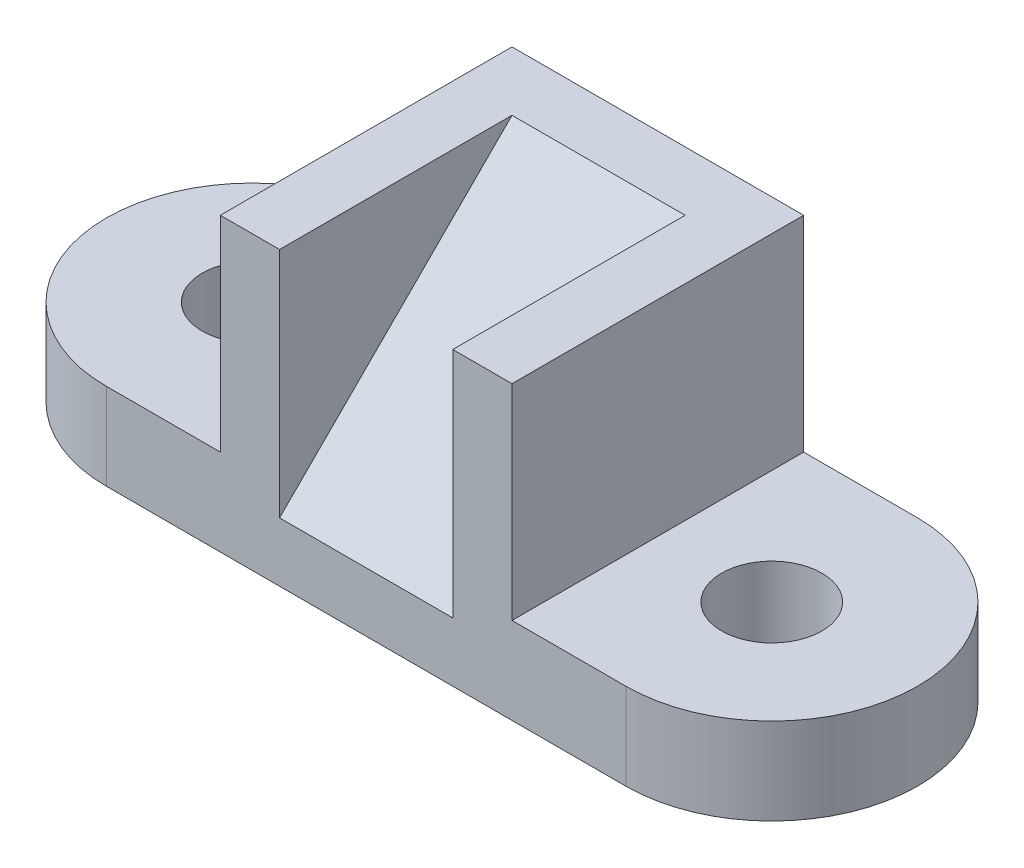
ISO-10303-21;
HEADER;
FILE_DESCRIPTION(('STEP AP214'),'2;1');
FILE_NAME('part.step','',(''),(''),'','','');
FILE_SCHEMA(('AUTOMOTIVE_DESIGN { 1 0 10303 214 1 1 1 1 }'));
ENDSEC;
DATA;
#1=APPLICATION_CONTEXT('core data for automotive mechanical design processes');
#2=APPLICATION_PROTOCOL_DEFINITION('international standard','automotive_design',2000,#1);
#3=PRODUCT_CONTEXT('',#1,'mechanical');
#4=PRODUCT('Part','Part','',(#3));
#5=PRODUCT_RELATED_PRODUCT_CATEGORY('part','',(#4));
#6=PRODUCT_DEFINITION_FORMATION('','',#4);
#7=PRODUCT_DEFINITION_CONTEXT('part definition',#1,'design');
#8=PRODUCT_DEFINITION('design','',#6,#7);
#9=PRODUCT_DEFINITION_SHAPE('','',#8);
#10=(LENGTH_UNIT() NAMED_UNIT(*) SI_UNIT(.MILLI.,.METRE.));
#11=(NAMED_UNIT(*) PLANE_ANGLE_UNIT() SI_UNIT($,.RADIAN.));
#12=(NAMED_UNIT(*) SI_UNIT($,.STERADIAN.) SOLID_ANGLE_UNIT());
#13=UNCERTAINTY_MEASURE_WITH_UNIT(LENGTH_MEASURE(1.E-05),#10,'distance_accuracy_value','');
#14=(GEOMETRIC_REPRESENTATION_CONTEXT(3) GLOBAL_UNCERTAINTY_ASSIGNED_CONTEXT((#13)) GLOBAL_UNIT_ASSIGNED_CONTEXT((#10,
#11,#12)) REPRESENTATION_CONTEXT('',''));
#15=CARTESIAN_POINT('',(0.,0.,0.));
#16=DIRECTION('',(0.,0.,1.));
#17=DIRECTION('',(1.,0.,0.));
#18=AXIS2_PLACEMENT_3D('',#15,#16,#17);
#19=CARTESIAN_POINT('',(57.,19.,0.));
#20=DIRECTION('',(0.,1.,0.));
#21=DIRECTION('',(0.,0.,1.));
#22=AXIS2_PLACEMENT_3D('',#19,#20,#21);
#23=PLANE('',#22);
#24=CARTESIAN_POINT('',(57.,19.,0.));
#25=DIRECTION('',(0.,1.,0.));
#26=DIRECTION('',(0.,0.,1.));
#27=AXIS2_PLACEMENT_3D('',#24,#25,#26);
#28=CIRCLE('',#27,11.);
#29=CARTESIAN_POINT('',(57.,19.,-11.));
#30=VERTEX_POINT('',#29);
#31=EDGE_CURVE('E141',#30,#30,#28,.T.);
#32=ORIENTED_EDGE('',*,*,#31,.F.);
#33=EDGE_LOOP('',(#32));
#34=FACE_BOUND('',#33,.T.);
#35=DIRECTION('',(-1.,0.,0.));
#36=VECTOR('',#35,1.);
#37=CARTESIAN_POINT('',(57.,19.,-32.));
#38=LINE('',#37,#36);
#39=CARTESIAN_POINT('',(57.,19.,-32.));
#40=VERTEX_POINT('',#39);
#41=CARTESIAN_POINT('',(32.,19.,-32.));
#42=VERTEX_POINT('',#41);
#43=EDGE_CURVE('E56',#40,#42,#38,.T.);
#44=ORIENTED_EDGE('',*,*,#43,.T.);
#45=DIRECTION('',(0.,0.,-1.));
#46=VECTOR('',#45,1.);
#47=CARTESIAN_POINT('',(32.,19.,32.));
#48=LINE('',#47,#46);
#49=CARTESIAN_POINT('',(32.,19.,32.));
#50=VERTEX_POINT('',#49);
#51=EDGE_CURVE('E140',#50,#42,#48,.T.);
#52=ORIENTED_EDGE('',*,*,#51,.F.);
#53=DIRECTION('',(1.,0.,0.));
#54=VECTOR('',#53,1.);
#55=CARTESIAN_POINT('',(19.,19.,32.));
#56=LINE('',#55,#54);
#57=CARTESIAN_POINT('',(57.,19.,32.));
#58=VERTEX_POINT('',#57);
#59=EDGE_CURVE('E154',#50,#58,#56,.T.);
#60=ORIENTED_EDGE('',*,*,#59,.T.);
#61=CARTESIAN_POINT('',(57.,19.,0.));
#62=DIRECTION('',(0.,1.,0.));
#63=DIRECTION('',(0.,0.,1.));
#64=AXIS2_PLACEMENT_3D('',#61,#62,#63);
#65=CIRCLE('',#64,32.);
#66=EDGE_CURVE('E156',#58,#40,#65,.T.);
#67=ORIENTED_EDGE('',*,*,#66,.T.);
#68=EDGE_LOOP('',(#44,#52,#60,#67));
#69=FACE_BOUND('',#68,.T.);
#70=ADVANCED_FACE('F33',(#34,#69),#23,.T.);
#71=CARTESIAN_POINT('',(-57.,19.,0.));
#72=DIRECTION('',(0.,1.,0.));
#73=DIRECTION('',(0.,0.,1.));
#74=AXIS2_PLACEMENT_3D('',#71,#72,#73);
#75=CIRCLE('',#74,11.);
#76=CARTESIAN_POINT('',(-57.,19.,-11.));
#77=VERTEX_POINT('',#76);
#78=EDGE_CURVE('E144',#77,#77,#75,.T.);
#79=ORIENTED_EDGE('',*,*,#78,.F.);
#80=EDGE_LOOP('',(#79));
#81=FACE_BOUND('',#80,.T.);
#82=DIRECTION('',(1.,0.,0.));
#83=VECTOR('',#82,1.);
#84=CARTESIAN_POINT('',(-57.,19.,32.));
#85=LINE('',#84,#83);
#86=CARTESIAN_POINT('',(-57.,19.,32.));
#87=VERTEX_POINT('',#86);
#88=CARTESIAN_POINT('',(-32.,19.,32.));
#89=VERTEX_POINT('',#88);
#90=EDGE_CURVE('E152',#87,#89,#85,.T.);
#91=ORIENTED_EDGE('',*,*,#90,.T.);
#92=DIRECTION('',(0.,0.,1.));
#93=VECTOR('',#92,1.);
#94=CARTESIAN_POINT('',(-32.,19.,32.));
#95=LINE('',#94,#93);
#96=CARTESIAN_POINT('',(-32.,19.,-32.));
#97=VERTEX_POINT('',#96);
#98=EDGE_CURVE('E48',#97,#89,#95,.T.);
#99=ORIENTED_EDGE('',*,*,#98,.F.);
#100=CARTESIAN_POINT('',(-57.,19.,-32.));
#101=VERTEX_POINT('',#100);
#102=EDGE_CURVE('E158',#97,#101,#38,.T.);
#103=ORIENTED_EDGE('',*,*,#102,.T.);
#104=CARTESIAN_POINT('',(-57.,19.,0.));
#105=DIRECTION('',(0.,1.,0.));
#106=DIRECTION('',(0.,0.,1.));
#107=AXIS2_PLACEMENT_3D('',#104,#105,#106);
#108=CIRCLE('',#107,32.);
#109=EDGE_CURVE('E160',#101,#87,#108,.T.);
#110=ORIENTED_EDGE('',*,*,#109,.T.);
#111=EDGE_LOOP('',(#91,#99,#103,#110));
#112=FACE_BOUND('',#111,.T.);
#113=ADVANCED_FACE('F257',(#81,#112),#23,.T.);
#114=CARTESIAN_POINT('',(57.,0.,0.));
#115=DIRECTION('',(0.,1.,0.));
#116=DIRECTION('',(0.,0.,1.));
#117=AXIS2_PLACEMENT_3D('',#114,#115,#116);
#118=PLANE('',#117);
#119=CARTESIAN_POINT('',(57.,0.,0.));
#120=DIRECTION('',(0.,1.,0.));
#121=DIRECTION('',(0.,0.,1.));
#122=AXIS2_PLACEMENT_3D('',#119,#120,#121);
#123=CIRCLE('',#122,32.);
#124=CARTESIAN_POINT('',(57.,0.,32.));
#125=VERTEX_POINT('',#124);
#126=CARTESIAN_POINT('',(57.,0.,-32.));
#127=VERTEX_POINT('',#126);
#128=EDGE_CURVE('E184',#125,#127,#123,.T.);
#129=ORIENTED_EDGE('',*,*,#128,.F.);
#130=DIRECTION('',(1.,0.,0.));
#131=VECTOR('',#130,1.);
#132=CARTESIAN_POINT('',(-57.,0.,32.));
#133=LINE('',#132,#131);
#134=CARTESIAN_POINT('',(-57.,0.,32.));
#135=VERTEX_POINT('',#134);
#136=EDGE_CURVE('E191',#135,#125,#133,.T.);
#137=ORIENTED_EDGE('',*,*,#136,.F.);
#138=CARTESIAN_POINT('',(-57.,0.,0.));
#139=DIRECTION('',(0.,1.,0.));
#140=DIRECTION('',(0.,0.,1.));
#141=AXIS2_PLACEMENT_3D('',#138,#139,#140);
#142=CIRCLE('',#141,32.);
#143=CARTESIAN_POINT('',(-57.,0.,-32.));
#144=VERTEX_POINT('',#143);
#145=EDGE_CURVE('E189',#144,#135,#142,.T.);
#146=ORIENTED_EDGE('',*,*,#145,.F.);
#147=DIRECTION('',(-1.,0.,0.));
#148=VECTOR('',#147,1.);
#149=CARTESIAN_POINT('',(-57.,0.,-32.));
#150=LINE('',#149,#148);
#151=EDGE_CURVE('E187',#127,#144,#150,.T.);
#152=ORIENTED_EDGE('',*,*,#151,.F.);
#153=EDGE_LOOP('',(#129,#137,#146,#152));
#154=FACE_BOUND('',#153,.T.);
#155=CARTESIAN_POINT('',(-57.,0.,0.));
#156=DIRECTION('',(0.,1.,0.));
#157=DIRECTION('',(0.,0.,1.));
#158=AXIS2_PLACEMENT_3D('',#155,#156,#157);
#159=CIRCLE('',#158,11.);
#160=CARTESIAN_POINT('',(-57.,0.,-11.));
#161=VERTEX_POINT('',#160);
#162=EDGE_CURVE('E181',#161,#161,#159,.T.);
#163=ORIENTED_EDGE('',*,*,#162,.T.);
#164=EDGE_LOOP('',(#163));
#165=FACE_BOUND('',#164,.T.);
#166=CARTESIAN_POINT('',(57.,0.,0.));
#167=DIRECTION('',(0.,1.,0.));
#168=DIRECTION('',(0.,0.,1.));
#169=AXIS2_PLACEMENT_3D('',#166,#167,#168);
#170=CIRCLE('',#169,11.);
#171=CARTESIAN_POINT('',(57.,0.,-11.));
#172=VERTEX_POINT('',#171);
#173=EDGE_CURVE('E178',#172,#172,#170,.T.);
#174=ORIENTED_EDGE('',*,*,#173,.T.);
#175=EDGE_LOOP('',(#174));
#176=FACE_BOUND('',#175,.T.);
#177=ADVANCED_FACE('F207',(#154,#165,#176),#118,.F.);
#178=CARTESIAN_POINT('',(57.,13.,0.));
#179=DIRECTION('',(0.,-1.,0.));
#180=DIRECTION('',(0.,0.,-1.));
#181=AXIS2_PLACEMENT_3D('',#178,#179,#180);
#182=CYLINDRICAL_SURFACE('',#181,32.);
#183=ORIENTED_EDGE('',*,*,#128,.T.);
#184=DIRECTION('',(0.,-1.,0.));
#185=VECTOR('',#184,1.);
#186=CARTESIAN_POINT('',(57.,13.,-32.));
#187=LINE('',#186,#185);
#188=EDGE_CURVE('E11',#40,#127,#187,.T.);
#189=ORIENTED_EDGE('',*,*,#188,.F.);
#190=ORIENTED_EDGE('',*,*,#66,.F.);
#191=DIRECTION('',(0.,-1.,0.));
#192=VECTOR('',#191,1.);
#193=CARTESIAN_POINT('',(57.,13.,32.));
#194=LINE('',#193,#192);
#195=EDGE_CURVE('E193',#58,#125,#194,.T.);
#196=ORIENTED_EDGE('',*,*,#195,.T.);
#197=EDGE_LOOP('',(#183,#189,#190,#196));
#198=FACE_BOUND('',#197,.T.);
#199=ADVANCED_FACE('F35',(#198),#182,.T.);
#200=CARTESIAN_POINT('',(-57.,13.,-32.));
#201=DIRECTION('',(0.,0.,1.));
#202=DIRECTION('',(1.,0.,0.));
#203=AXIS2_PLACEMENT_3D('',#200,#201,#202);
#204=PLANE('',#203);
#205=ORIENTED_EDGE('',*,*,#151,.T.);
#206=DIRECTION('',(0.,-1.,0.));
#207=VECTOR('',#206,1.);
#208=CARTESIAN_POINT('',(-57.,13.,-32.));
#209=LINE('',#208,#207);
#210=EDGE_CURVE('E41',#101,#144,#209,.T.);
#211=ORIENTED_EDGE('',*,*,#210,.F.);
#212=ORIENTED_EDGE('',*,*,#102,.F.);
#213=DIRECTION('',(0.,-1.,0.));
#214=VECTOR('',#213,1.);
#215=CARTESIAN_POINT('',(-32.,64.,-32.));
#216=LINE('',#215,#214);
#217=CARTESIAN_POINT('',(-32.,64.,-32.));
#218=VERTEX_POINT('',#217);
#219=EDGE_CURVE('E124',#218,#97,#216,.T.);
#220=ORIENTED_EDGE('',*,*,#219,.F.);
#221=DIRECTION('',(-1.,0.,0.));
#222=VECTOR('',#221,1.);
#223=CARTESIAN_POINT('',(-32.,64.,-32.));
#224=LINE('',#223,#222);
#225=CARTESIAN_POINT('',(32.,64.,-32.));
#226=VERTEX_POINT('',#225);
#227=EDGE_CURVE('E117',#226,#218,#224,.T.);
#228=ORIENTED_EDGE('',*,*,#227,.F.);
#229=DIRECTION('',(0.,-1.,0.));
#230=VECTOR('',#229,1.);
#231=CARTESIAN_POINT('',(32.,64.,-32.));
#232=LINE('',#231,#230);
#233=EDGE_CURVE('E121',#226,#42,#232,.T.);
#234=ORIENTED_EDGE('',*,*,#233,.T.);
#235=ORIENTED_EDGE('',*,*,#43,.F.);
#236=ORIENTED_EDGE('',*,*,#188,.T.);
#237=EDGE_LOOP('',(#205,#211,#212,#220,#228,#234,#235,#236));
#238=FACE_BOUND('',#237,.T.);
#239=ADVANCED_FACE('F119',(#238),#204,.F.);
#240=CARTESIAN_POINT('',(-57.,13.,0.));
#241=DIRECTION('',(0.,-1.,0.));
#242=DIRECTION('',(0.,0.,-1.));
#243=AXIS2_PLACEMENT_3D('',#240,#241,#242);
#244=CYLINDRICAL_SURFACE('',#243,32.);
#245=ORIENTED_EDGE('',*,*,#145,.T.);
#246=DIRECTION('',(0.,-1.,0.));
#247=VECTOR('',#246,1.);
#248=CARTESIAN_POINT('',(-57.,13.,32.));
#249=LINE('',#248,#247);
#250=EDGE_CURVE('E196',#87,#135,#249,.T.);
#251=ORIENTED_EDGE('',*,*,#250,.F.);
#252=ORIENTED_EDGE('',*,*,#109,.F.);
#253=ORIENTED_EDGE('',*,*,#210,.T.);
#254=EDGE_LOOP('',(#245,#251,#252,#253));
#255=FACE_BOUND('',#254,.T.);
#256=ADVANCED_FACE('F203',(#255),#244,.T.);
#257=CARTESIAN_POINT('',(-57.,13.,32.));
#258=DIRECTION('',(0.,0.,-1.));
#259=DIRECTION('',(-1.,0.,0.));
#260=AXIS2_PLACEMENT_3D('',#257,#258,#259);
#261=PLANE('',#260);
#262=ORIENTED_EDGE('',*,*,#195,.F.);
#263=ORIENTED_EDGE('',*,*,#59,.F.);
#264=DIRECTION('',(0.,-1.,0.));
#265=VECTOR('',#264,1.);
#266=CARTESIAN_POINT('',(32.,64.,32.));
#267=LINE('',#266,#265);
#268=CARTESIAN_POINT('',(32.,64.,32.));
#269=VERTEX_POINT('',#268);
#270=EDGE_CURVE('E215',#269,#50,#267,.T.);
#271=ORIENTED_EDGE('',*,*,#270,.F.);
#272=DIRECTION('',(1.,0.,0.));
#273=VECTOR('',#272,1.);
#274=CARTESIAN_POINT('',(19.,64.,32.));
#275=LINE('',#274,#273);
#276=CARTESIAN_POINT('',(19.,64.,32.));
#277=VERTEX_POINT('',#276);
#278=EDGE_CURVE('E134',#277,#269,#275,.T.);
#279=ORIENTED_EDGE('',*,*,#278,.F.);
#280=DIRECTION('',(0.,-1.,0.));
#281=VECTOR('',#280,1.);
#282=CARTESIAN_POINT('',(19.,19.,32.));
#283=LINE('',#282,#281);
#284=CARTESIAN_POINT('',(19.,13.,32.));
#285=VERTEX_POINT('',#284);
#286=EDGE_CURVE('E163',#277,#285,#283,.T.);
#287=ORIENTED_EDGE('',*,*,#286,.T.);
#288=DIRECTION('',(-1.,0.,0.));
#289=VECTOR('',#288,1.);
#290=CARTESIAN_POINT('',(89.,13.,32.));
#291=LINE('',#290,#289);
#292=CARTESIAN_POINT('',(-19.,13.,32.));
#293=VERTEX_POINT('',#292);
#294=EDGE_CURVE('E171',#285,#293,#291,.T.);
#295=ORIENTED_EDGE('',*,*,#294,.T.);
#296=DIRECTION('',(0.,-1.,0.));
#297=VECTOR('',#296,1.);
#298=CARTESIAN_POINT('',(-19.,19.,32.));
#299=LINE('',#298,#297);
#300=CARTESIAN_POINT('',(-19.,64.,32.));
#301=VERTEX_POINT('',#300);
#302=EDGE_CURVE('E166',#301,#293,#299,.T.);
#303=ORIENTED_EDGE('',*,*,#302,.F.);
#304=DIRECTION('',(1.,0.,0.));
#305=VECTOR('',#304,1.);
#306=CARTESIAN_POINT('',(-32.,64.,32.));
#307=LINE('',#306,#305);
#308=CARTESIAN_POINT('',(-32.,64.,32.));
#309=VERTEX_POINT('',#308);
#310=EDGE_CURVE('E227',#309,#301,#307,.T.);
#311=ORIENTED_EDGE('',*,*,#310,.F.);
#312=DIRECTION('',(0.,-1.,0.));
#313=VECTOR('',#312,1.);
#314=CARTESIAN_POINT('',(-32.,64.,32.));
#315=LINE('',#314,#313);
#316=EDGE_CURVE('E146',#309,#89,#315,.T.);
#317=ORIENTED_EDGE('',*,*,#316,.T.);
#318=ORIENTED_EDGE('',*,*,#90,.F.);
#319=ORIENTED_EDGE('',*,*,#250,.T.);
#320=ORIENTED_EDGE('',*,*,#136,.T.);
#321=EDGE_LOOP('',(#262,#263,#271,#279,#287,#295,#303,#311,#317,#318,#319,#320));
#322=FACE_BOUND('',#321,.T.);
#323=ADVANCED_FACE('F211',(#322),#261,.F.);
#324=CARTESIAN_POINT('',(-57.,13.,0.));
#325=DIRECTION('',(0.,-1.,0.));
#326=DIRECTION('',(0.,0.,-1.));
#327=AXIS2_PLACEMENT_3D('',#324,#325,#326);
#328=CYLINDRICAL_SURFACE('',#327,11.);
#329=CARTESIAN_POINT('',(-57.,0.,-11.));
#330=CARTESIAN_POINT('',(-57.,0.197916666666667,-11.));
#331=CARTESIAN_POINT('',(-57.,0.395833333333334,-11.));
#332=CARTESIAN_POINT('',(-57.,0.791666666666667,-11.));
#333=CARTESIAN_POINT('',(-57.,0.989583333333334,-11.));
#334=CARTESIAN_POINT('',(-57.,1.38541666666667,-11.));
#335=CARTESIAN_POINT('',(-57.,1.58333333333333,-11.));
#336=CARTESIAN_POINT('',(-57.,1.97916666666667,-11.));
#337=CARTESIAN_POINT('',(-57.,2.17708333333333,-11.));
#338=CARTESIAN_POINT('',(-57.,2.57291666666667,-11.));
#339=CARTESIAN_POINT('',(-57.,2.77083333333333,-11.));
#340=CARTESIAN_POINT('',(-57.,3.16666666666667,-11.));
#341=CARTESIAN_POINT('',(-57.,3.36458333333333,-11.));
#342=CARTESIAN_POINT('',(-57.,3.76041666666667,-11.));
#343=CARTESIAN_POINT('',(-57.,3.95833333333333,-11.));
#344=CARTESIAN_POINT('',(-57.,4.35416666666667,-11.));
#345=CARTESIAN_POINT('',(-57.,4.55208333333333,-11.));
#346=CARTESIAN_POINT('',(-57.,4.94791666666667,-11.));
#347=CARTESIAN_POINT('',(-57.,5.14583333333333,-11.));
#348=CARTESIAN_POINT('',(-57.,5.54166666666667,-11.));
#349=CARTESIAN_POINT('',(-57.,5.73958333333333,-11.));
#350=CARTESIAN_POINT('',(-57.,6.13541666666667,-11.));
#351=CARTESIAN_POINT('',(-57.,6.33333333333333,-11.));
#352=CARTESIAN_POINT('',(-57.,6.72916666666667,-11.));
#353=CARTESIAN_POINT('',(-57.,6.92708333333333,-11.));
#354=CARTESIAN_POINT('',(-57.,7.32291666666667,-11.));
#355=CARTESIAN_POINT('',(-57.,7.52083333333333,-11.));
#356=CARTESIAN_POINT('',(-57.,7.91666666666667,-11.));
#357=CARTESIAN_POINT('',(-57.,8.11458333333333,-11.));
#358=CARTESIAN_POINT('',(-57.,8.51041666666667,-11.));
#359=CARTESIAN_POINT('',(-57.,8.70833333333333,-11.));
#360=CARTESIAN_POINT('',(-57.,9.10416666666667,-11.));
#361=CARTESIAN_POINT('',(-57.,9.30208333333333,-11.));
#362=CARTESIAN_POINT('',(-57.,9.69791666666667,-11.));
#363=CARTESIAN_POINT('',(-57.,9.89583333333333,-11.));
#364=CARTESIAN_POINT('',(-57.,10.2916666666667,-11.));
#365=CARTESIAN_POINT('',(-57.,10.4895833333333,-11.));
#366=CARTESIAN_POINT('',(-57.,10.8854166666667,-11.));
#367=CARTESIAN_POINT('',(-57.,11.0833333333333,-11.));
#368=CARTESIAN_POINT('',(-57.,11.4791666666667,-11.));
#369=CARTESIAN_POINT('',(-57.,11.6770833333333,-11.));
#370=CARTESIAN_POINT('',(-57.,12.0729166666667,-11.));
#371=CARTESIAN_POINT('',(-57.,12.2708333333333,-11.));
#372=CARTESIAN_POINT('',(-57.,12.6666666666667,-11.));
#373=CARTESIAN_POINT('',(-57.,12.8645833333333,-11.));
#374=CARTESIAN_POINT('',(-57.,13.2604166666667,-11.));
#375=CARTESIAN_POINT('',(-57.,13.4583333333333,-11.));
#376=CARTESIAN_POINT('',(-57.,13.8541666666667,-11.));
#377=CARTESIAN_POINT('',(-57.,14.0520833333333,-11.));
#378=CARTESIAN_POINT('',(-57.,14.4479166666667,-11.));
#379=CARTESIAN_POINT('',(-57.,14.6458333333333,-11.));
#380=CARTESIAN_POINT('',(-57.,15.0416666666667,-11.));
#381=CARTESIAN_POINT('',(-57.,15.2395833333333,-11.));
#382=CARTESIAN_POINT('',(-57.,15.6354166666667,-11.));
#383=CARTESIAN_POINT('',(-57.,15.8333333333333,-11.));
#384=CARTESIAN_POINT('',(-57.,16.2291666666667,-11.));
#385=CARTESIAN_POINT('',(-57.,16.4270833333333,-11.));
#386=CARTESIAN_POINT('',(-57.,16.8229166666667,-11.));
#387=CARTESIAN_POINT('',(-57.,17.0208333333333,-11.));
#388=CARTESIAN_POINT('',(-57.,17.4166666666667,-11.));
#389=CARTESIAN_POINT('',(-57.,17.6145833333333,-11.));
#390=CARTESIAN_POINT('',(-57.,18.0104166666667,-11.));
#391=CARTESIAN_POINT('',(-57.,18.2083333333333,-11.));
#392=CARTESIAN_POINT('',(-57.,18.6041666666667,-11.));
#393=CARTESIAN_POINT('',(-57.,18.8020833333333,-11.));
#394=CARTESIAN_POINT('',(-57.,19.,-11.));
#395=B_SPLINE_CURVE_WITH_KNOTS('',3,(#329,#330,#331,#332,#333,#334,#335,#336,#337,#338,#339,
#340,#341,#342,#343,#344,#345,#346,#347,#348,#349,#350,#351,#352,#353,#354,#355,#356,#357,#358,
#359,#360,#361,#362,#363,#364,#365,#366,#367,#368,#369,#370,#371,#372,#373,#374,#375,#376,#377,
#378,#379,#380,#381,#382,#383,#384,#385,#386,#387,#388,#389,#390,#391,#392,#393,#394),
.UNSPECIFIED.,.F.,.F.,(4,2,2,2,2,2,2,2,2,2,2,2,2,2,2,2,2,2,2,2,2,2,2,2,2,2,2,2,2,2,2,2,4),(0.,
0.593750000000001,1.1875,1.78125,2.375,2.96875,3.5625,4.15625,4.75,5.34375,5.9375,6.53125,7.125,
7.71875,8.3125,8.90625,9.5,10.09375,10.6875,11.28125,11.875,12.46875,13.0625,13.65625,14.25,
14.84375,15.4375,16.03125,16.625,17.21875,17.8125,18.40625,19.),.UNSPECIFIED.);
#396=EDGE_CURVE('BSEAM253',#161,#77,#395,.T.);
#397=ORIENTED_EDGE('',*,*,#162,.F.);
#398=ORIENTED_EDGE('',*,*,#78,.T.);
#399=ORIENTED_EDGE('',*,*,#396,.T.);
#400=ORIENTED_EDGE('',*,*,#396,.F.);
#401=EDGE_LOOP('',(#397,#399,#398,#400));
#402=FACE_BOUND('',#401,.T.);
#403=ADVANCED_FACE('F253',(#402),#328,.F.);
#404=CARTESIAN_POINT('',(57.,13.,0.));
#405=DIRECTION('',(0.,-1.,0.));
#406=DIRECTION('',(0.,0.,-1.));
#407=AXIS2_PLACEMENT_3D('',#404,#405,#406);
#408=CYLINDRICAL_SURFACE('',#407,11.);
#409=CARTESIAN_POINT('',(57.,0.,-11.));
#410=CARTESIAN_POINT('',(57.,0.197916666666667,-11.));
#411=CARTESIAN_POINT('',(57.,0.395833333333334,-11.));
#412=CARTESIAN_POINT('',(57.,0.791666666666667,-11.));
#413=CARTESIAN_POINT('',(57.,0.989583333333334,-11.));
#414=CARTESIAN_POINT('',(57.,1.38541666666667,-11.));
#415=CARTESIAN_POINT('',(57.,1.58333333333333,-11.));
#416=CARTESIAN_POINT('',(57.,1.97916666666667,-11.));
#417=CARTESIAN_POINT('',(57.,2.17708333333333,-11.));
#418=CARTESIAN_POINT('',(57.,2.57291666666667,-11.));
#419=CARTESIAN_POINT('',(57.,2.77083333333333,-11.));
#420=CARTESIAN_POINT('',(57.,3.16666666666667,-11.));
#421=CARTESIAN_POINT('',(57.,3.36458333333333,-11.));
#422=CARTESIAN_POINT('',(57.,3.76041666666667,-11.));
#423=CARTESIAN_POINT('',(57.,3.95833333333333,-11.));
#424=CARTESIAN_POINT('',(57.,4.35416666666667,-11.));
#425=CARTESIAN_POINT('',(57.,4.55208333333333,-11.));
#426=CARTESIAN_POINT('',(57.,4.94791666666667,-11.));
#427=CARTESIAN_POINT('',(57.,5.14583333333333,-11.));
#428=CARTESIAN_POINT('',(57.,5.54166666666667,-11.));
#429=CARTESIAN_POINT('',(57.,5.73958333333333,-11.));
#430=CARTESIAN_POINT('',(57.,6.13541666666667,-11.));
#431=CARTESIAN_POINT('',(57.,6.33333333333333,-11.));
#432=CARTESIAN_POINT('',(57.,6.72916666666667,-11.));
#433=CARTESIAN_POINT('',(57.,6.92708333333333,-11.));
#434=CARTESIAN_POINT('',(57.,7.32291666666667,-11.));
#435=CARTESIAN_POINT('',(57.,7.52083333333333,-11.));
#436=CARTESIAN_POINT('',(57.,7.91666666666667,-11.));
#437=CARTESIAN_POINT('',(57.,8.11458333333333,-11.));
#438=CARTESIAN_POINT('',(57.,8.51041666666667,-11.));
#439=CARTESIAN_POINT('',(57.,8.70833333333333,-11.));
#440=CARTESIAN_POINT('',(57.,9.10416666666667,-11.));
#441=CARTESIAN_POINT('',(57.,9.30208333333333,-11.));
#442=CARTESIAN_POINT('',(57.,9.69791666666667,-11.));
#443=CARTESIAN_POINT('',(57.,9.89583333333333,-11.));
#444=CARTESIAN_POINT('',(57.,10.2916666666667,-11.));
#445=CARTESIAN_POINT('',(57.,10.4895833333333,-11.));
#446=CARTESIAN_POINT('',(57.,10.8854166666667,-11.));
#447=CARTESIAN_POINT('',(57.,11.0833333333333,-11.));
#448=CARTESIAN_POINT('',(57.,11.4791666666667,-11.));
#449=CARTESIAN_POINT('',(57.,11.6770833333333,-11.));
#450=CARTESIAN_POINT('',(57.,12.0729166666667,-11.));
#451=CARTESIAN_POINT('',(57.,12.2708333333333,-11.));
#452=CARTESIAN_POINT('',(57.,12.6666666666667,-11.));
#453=CARTESIAN_POINT('',(57.,12.8645833333333,-11.));
#454=CARTESIAN_POINT('',(57.,13.2604166666667,-11.));
#455=CARTESIAN_POINT('',(57.,13.4583333333333,-11.));
#456=CARTESIAN_POINT('',(57.,13.8541666666667,-11.));
#457=CARTESIAN_POINT('',(57.,14.0520833333333,-11.));
#458=CARTESIAN_POINT('',(57.,14.4479166666667,-11.));
#459=CARTESIAN_POINT('',(57.,14.6458333333333,-11.));
#460=CARTESIAN_POINT('',(57.,15.0416666666667,-11.));
#461=CARTESIAN_POINT('',(57.,15.2395833333333,-11.));
#462=CARTESIAN_POINT('',(57.,15.6354166666667,-11.));
#463=CARTESIAN_POINT('',(57.,15.8333333333333,-11.));
#464=CARTESIAN_POINT('',(57.,16.2291666666667,-11.));
#465=CARTESIAN_POINT('',(57.,16.4270833333333,-11.));
#466=CARTESIAN_POINT('',(57.,16.8229166666667,-11.));
#467=CARTESIAN_POINT('',(57.,17.0208333333333,-11.));
#468=CARTESIAN_POINT('',(57.,17.4166666666667,-11.));
#469=CARTESIAN_POINT('',(57.,17.6145833333333,-11.));
#470=CARTESIAN_POINT('',(57.,18.0104166666667,-11.));
#471=CARTESIAN_POINT('',(57.,18.2083333333333,-11.));
#472=CARTESIAN_POINT('',(57.,18.6041666666667,-11.));
#473=CARTESIAN_POINT('',(57.,18.8020833333333,-11.));
#474=CARTESIAN_POINT('',(57.,19.,-11.));
#475=B_SPLINE_CURVE_WITH_KNOTS('',3,(#409,#410,#411,#412,#413,#414,#415,#416,#417,#418,#419,
#420,#421,#422,#423,#424,#425,#426,#427,#428,#429,#430,#431,#432,#433,#434,#435,#436,#437,#438,
#439,#440,#441,#442,#443,#444,#445,#446,#447,#448,#449,#450,#451,#452,#453,#454,#455,#456,#457,
#458,#459,#460,#461,#462,#463,#464,#465,#466,#467,#468,#469,#470,#471,#472,#473,#474),
.UNSPECIFIED.,.F.,.F.,(4,2,2,2,2,2,2,2,2,2,2,2,2,2,2,2,2,2,2,2,2,2,2,2,2,2,2,2,2,2,2,2,4),(0.,
0.593750000000001,1.1875,1.78125,2.375,2.96875,3.5625,4.15625,4.75,5.34375,5.9375,6.53125,7.125,
7.71875,8.3125,8.90625,9.5,10.09375,10.6875,11.28125,11.875,12.46875,13.0625,13.65625,14.25,
14.84375,15.4375,16.03125,16.625,17.21875,17.8125,18.40625,19.),.UNSPECIFIED.);
#476=EDGE_CURVE('BSEAM246',#172,#30,#475,.T.);
#477=ORIENTED_EDGE('',*,*,#173,.F.);
#478=ORIENTED_EDGE('',*,*,#31,.T.);
#479=ORIENTED_EDGE('',*,*,#476,.T.);
#480=ORIENTED_EDGE('',*,*,#476,.F.);
#481=EDGE_LOOP('',(#477,#479,#478,#480));
#482=FACE_BOUND('',#481,.T.);
#483=ADVANCED_FACE('F246',(#482),#408,.F.);
#484=CARTESIAN_POINT('',(89.,13.,32.));
#485=DIRECTION('',(0.,-0.707106781186548,-0.707106781186548));
#486=DIRECTION('',(0.,0.707106781186548,-0.707106781186548));
#487=AXIS2_PLACEMENT_3D('',#484,#485,#486);
#488=PLANE('',#487);
#489=DIRECTION('',(-1.,0.,0.));
#490=VECTOR('',#489,1.);
#491=CARTESIAN_POINT('',(-19.,64.,-19.));
#492=LINE('',#491,#490);
#493=CARTESIAN_POINT('',(19.,64.,-19.));
#494=VERTEX_POINT('',#493);
#495=CARTESIAN_POINT('',(-19.,64.,-19.));
#496=VERTEX_POINT('',#495);
#497=EDGE_CURVE('E176',#494,#496,#492,.T.);
#498=ORIENTED_EDGE('',*,*,#497,.T.);
#499=DIRECTION('',(0.,-0.707106781186547,0.707106781186547));
#500=VECTOR('',#499,1.);
#501=CARTESIAN_POINT('',(-19.,13.,32.));
#502=LINE('',#501,#500);
#503=EDGE_CURVE('E169',#496,#293,#502,.T.);
#504=ORIENTED_EDGE('',*,*,#503,.T.);
#505=ORIENTED_EDGE('',*,*,#294,.F.);
#506=DIRECTION('',(0.,-0.707106781186548,0.707106781186548));
#507=VECTOR('',#506,1.);
#508=CARTESIAN_POINT('',(19.,38.5,6.5));
#509=LINE('',#508,#507);
#510=EDGE_CURVE('E174',#494,#285,#509,.T.);
#511=ORIENTED_EDGE('',*,*,#510,.F.);
#512=EDGE_LOOP('',(#498,#504,#505,#511));
#513=FACE_BOUND('',#512,.T.);
#514=ADVANCED_FACE('F244',(#513),#488,.F.);
#515=CARTESIAN_POINT('',(-19.,19.,32.));
#516=DIRECTION('',(-1.,0.,0.));
#517=DIRECTION('',(0.,0.,1.));
#518=AXIS2_PLACEMENT_3D('',#515,#516,#517);
#519=PLANE('',#518);
#520=ORIENTED_EDGE('',*,*,#302,.T.);
#521=ORIENTED_EDGE('',*,*,#503,.F.);
#522=DIRECTION('',(0.,0.,-1.));
#523=VECTOR('',#522,1.);
#524=CARTESIAN_POINT('',(-19.,64.,26.));
#525=LINE('',#524,#523);
#526=EDGE_CURVE('E224',#301,#496,#525,.T.);
#527=ORIENTED_EDGE('',*,*,#526,.F.);
#528=EDGE_LOOP('',(#520,#521,#527));
#529=FACE_BOUND('',#528,.T.);
#530=ADVANCED_FACE('F238',(#529),#519,.F.);
#531=CARTESIAN_POINT('',(19.,19.,-19.));
#532=DIRECTION('',(1.,0.,0.));
#533=DIRECTION('',(0.,0.,-1.));
#534=AXIS2_PLACEMENT_3D('',#531,#532,#533);
#535=PLANE('',#534);
#536=ORIENTED_EDGE('',*,*,#286,.F.);
#537=DIRECTION('',(0.,0.,1.));
#538=VECTOR('',#537,1.);
#539=CARTESIAN_POINT('',(19.,64.,-19.));
#540=LINE('',#539,#538);
#541=EDGE_CURVE('E218',#494,#277,#540,.T.);
#542=ORIENTED_EDGE('',*,*,#541,.F.);
#543=ORIENTED_EDGE('',*,*,#510,.T.);
#544=EDGE_LOOP('',(#536,#542,#543));
#545=FACE_BOUND('',#544,.T.);
#546=ADVANCED_FACE('F243',(#545),#535,.F.);
#547=CARTESIAN_POINT('',(32.,64.,32.));
#548=DIRECTION('',(-1.,0.,0.));
#549=DIRECTION('',(0.,0.,1.));
#550=AXIS2_PLACEMENT_3D('',#547,#548,#549);
#551=PLANE('',#550);
#552=ORIENTED_EDGE('',*,*,#51,.T.);
#553=ORIENTED_EDGE('',*,*,#233,.F.);
#554=DIRECTION('',(0.,0.,-1.));
#555=VECTOR('',#554,1.);
#556=CARTESIAN_POINT('',(32.,64.,32.));
#557=LINE('',#556,#555);
#558=EDGE_CURVE('E128',#269,#226,#557,.T.);
#559=ORIENTED_EDGE('',*,*,#558,.F.);
#560=ORIENTED_EDGE('',*,*,#270,.T.);
#561=EDGE_LOOP('',(#552,#553,#559,#560));
#562=FACE_BOUND('',#561,.T.);
#563=ADVANCED_FACE('F139',(#562),#551,.F.);
#564=CARTESIAN_POINT('',(-32.,64.,32.));
#565=DIRECTION('',(1.,0.,0.));
#566=DIRECTION('',(0.,0.,-1.));
#567=AXIS2_PLACEMENT_3D('',#564,#565,#566);
#568=PLANE('',#567);
#569=ORIENTED_EDGE('',*,*,#98,.T.);
#570=ORIENTED_EDGE('',*,*,#316,.F.);
#571=DIRECTION('',(0.,0.,1.));
#572=VECTOR('',#571,1.);
#573=CARTESIAN_POINT('',(-32.,64.,32.));
#574=LINE('',#573,#572);
#575=EDGE_CURVE('E127',#218,#309,#574,.T.);
#576=ORIENTED_EDGE('',*,*,#575,.F.);
#577=ORIENTED_EDGE('',*,*,#219,.T.);
#578=EDGE_LOOP('',(#569,#570,#576,#577));
#579=FACE_BOUND('',#578,.T.);
#580=ADVANCED_FACE('F234',(#579),#568,.F.);
#581=CARTESIAN_POINT('',(0.,64.,0.));
#582=DIRECTION('',(0.,-1.,0.));
#583=DIRECTION('',(0.,0.,-1.));
#584=AXIS2_PLACEMENT_3D('',#581,#582,#583);
#585=PLANE('',#584);
#586=ORIENTED_EDGE('',*,*,#558,.T.);
#587=ORIENTED_EDGE('',*,*,#227,.T.);
#588=ORIENTED_EDGE('',*,*,#575,.T.);
#589=ORIENTED_EDGE('',*,*,#310,.T.);
#590=ORIENTED_EDGE('',*,*,#526,.T.);
#591=ORIENTED_EDGE('',*,*,#497,.F.);
#592=ORIENTED_EDGE('',*,*,#541,.T.);
#593=ORIENTED_EDGE('',*,*,#278,.T.);
#594=EDGE_LOOP('',(#586,#587,#588,#589,#590,#591,#592,#593));
#595=FACE_BOUND('',#594,.T.);
#596=ADVANCED_FACE('F131',(#595),#585,.F.);
#597=CLOSED_SHELL('',(#70,#113,#177,#199,#239,#256,#323,#403,#483,#514,#530,#546,#563,#580,#596));
#598=MANIFOLD_SOLID_BREP('B2',#597);
#599=ADVANCED_BREP_SHAPE_REPRESENTATION('',(#18,#598),#14);
#600=SHAPE_DEFINITION_REPRESENTATION(#9,#599);
ENDSEC;
END-ISO-10303-21;
